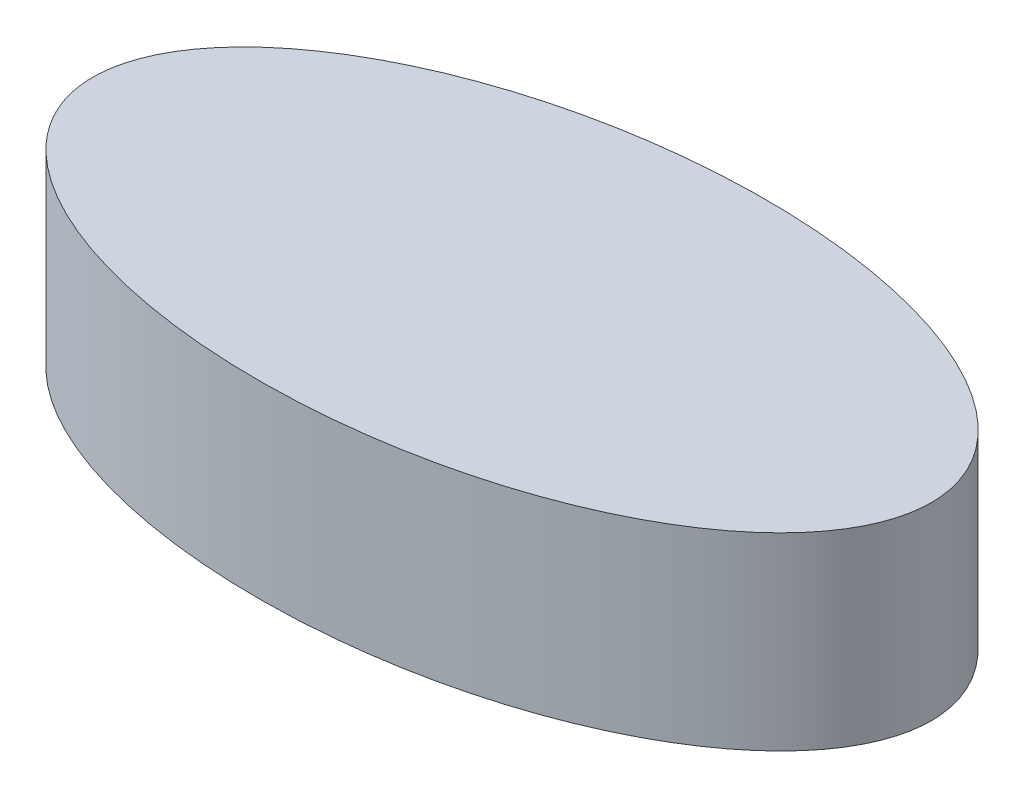
ISO-10303-21;
HEADER;
FILE_DESCRIPTION(('STEP AP214'),'2;1');
FILE_NAME('part.step','',(''),(''),'','','');
FILE_SCHEMA(('AUTOMOTIVE_DESIGN { 1 0 10303 214 1 1 1 1 }'));
ENDSEC;
DATA;
#1=APPLICATION_CONTEXT('core data for automotive mechanical design processes');
#2=APPLICATION_PROTOCOL_DEFINITION('international standard','automotive_design',2000,#1);
#3=PRODUCT_CONTEXT('',#1,'mechanical');
#4=PRODUCT('Part','Part','',(#3));
#5=PRODUCT_RELATED_PRODUCT_CATEGORY('part','',(#4));
#6=PRODUCT_DEFINITION_FORMATION('','',#4);
#7=PRODUCT_DEFINITION_CONTEXT('part definition',#1,'design');
#8=PRODUCT_DEFINITION('design','',#6,#7);
#9=PRODUCT_DEFINITION_SHAPE('','',#8);
#10=(LENGTH_UNIT() NAMED_UNIT(*) SI_UNIT(.MILLI.,.METRE.));
#11=(NAMED_UNIT(*) PLANE_ANGLE_UNIT() SI_UNIT($,.RADIAN.));
#12=(NAMED_UNIT(*) SI_UNIT($,.STERADIAN.) SOLID_ANGLE_UNIT());
#13=UNCERTAINTY_MEASURE_WITH_UNIT(LENGTH_MEASURE(1.E-05),#10,'distance_accuracy_value','');
#14=(GEOMETRIC_REPRESENTATION_CONTEXT(3) GLOBAL_UNCERTAINTY_ASSIGNED_CONTEXT((#13)) GLOBAL_UNIT_ASSIGNED_CONTEXT((#10,
#11,#12)) REPRESENTATION_CONTEXT('',''));
#15=CARTESIAN_POINT('',(0.,0.,0.));
#16=DIRECTION('',(0.,0.,1.));
#17=DIRECTION('',(1.,0.,0.));
#18=AXIS2_PLACEMENT_3D('',#15,#16,#17);
#19=CARTESIAN_POINT('',(0.,42.,0.));
#20=DIRECTION('',(0.,1.,0.));
#21=DIRECTION('',(0.996136597504946,0.,-0.087817305306357));
#22=AXIS2_PLACEMENT_3D('',#19,#20,#21);
#23=ELLIPSE('',#22,87.7947051264503,45.1032893956314);
#24=DIRECTION('',(0.,-1.,0.));
#25=VECTOR('',#24,1.);
#26=SURFACE_OF_LINEAR_EXTRUSION('',#23,#25);
#27=CARTESIAN_POINT('',(87.4555188436122,42.,-7.70989442437107));
#28=VERTEX_POINT('',#27);
#29=EDGE_CURVE('E10',#28,#28,#23,.T.);
#30=ORIENTED_EDGE('',*,*,#29,.F.);
#31=EDGE_LOOP('',(#30));
#32=FACE_BOUND('',#31,.T.);
#33=CARTESIAN_POINT('',(0.,0.,0.));
#34=DIRECTION('',(0.,1.,0.));
#35=DIRECTION('',(0.996136597504946,0.,-0.087817305306357));
#36=AXIS2_PLACEMENT_3D('',#33,#34,#35);
#37=ELLIPSE('',#36,87.7947051264503,45.1032893956314);
#38=CARTESIAN_POINT('',(87.4555188436122,0.,-7.70989442437107));
#39=VERTEX_POINT('',#38);
#40=EDGE_CURVE('E35',#39,#39,#37,.T.);
#41=ORIENTED_EDGE('',*,*,#40,.T.);
#42=EDGE_LOOP('',(#41));
#43=FACE_BOUND('',#42,.T.);
#44=ADVANCED_FACE('F31',(#32,#43),#26,.F.);
#45=CARTESIAN_POINT('',(0.,42.,0.));
#46=DIRECTION('',(0.,1.,0.));
#47=DIRECTION('',(0.,0.,1.));
#48=AXIS2_PLACEMENT_3D('',#45,#46,#47);
#49=PLANE('',#48);
#50=ORIENTED_EDGE('',*,*,#29,.T.);
#51=EDGE_LOOP('',(#50));
#52=FACE_BOUND('',#51,.T.);
#53=ADVANCED_FACE('F47',(#52),#49,.T.);
#54=CARTESIAN_POINT('',(0.,0.,0.));
#55=DIRECTION('',(0.,1.,0.));
#56=DIRECTION('',(0.,0.,1.));
#57=AXIS2_PLACEMENT_3D('',#54,#55,#56);
#58=PLANE('',#57);
#59=ORIENTED_EDGE('',*,*,#40,.F.);
#60=EDGE_LOOP('',(#59));
#61=FACE_BOUND('',#60,.T.);
#62=ADVANCED_FACE('F45',(#61),#58,.F.);
#63=CLOSED_SHELL('',(#44,#53,#62));
#64=MANIFOLD_SOLID_BREP('B2',#63);
#65=ADVANCED_BREP_SHAPE_REPRESENTATION('',(#18,#64),#14);
#66=SHAPE_DEFINITION_REPRESENTATION(#9,#65);
ENDSEC;
END-ISO-10303-21;
